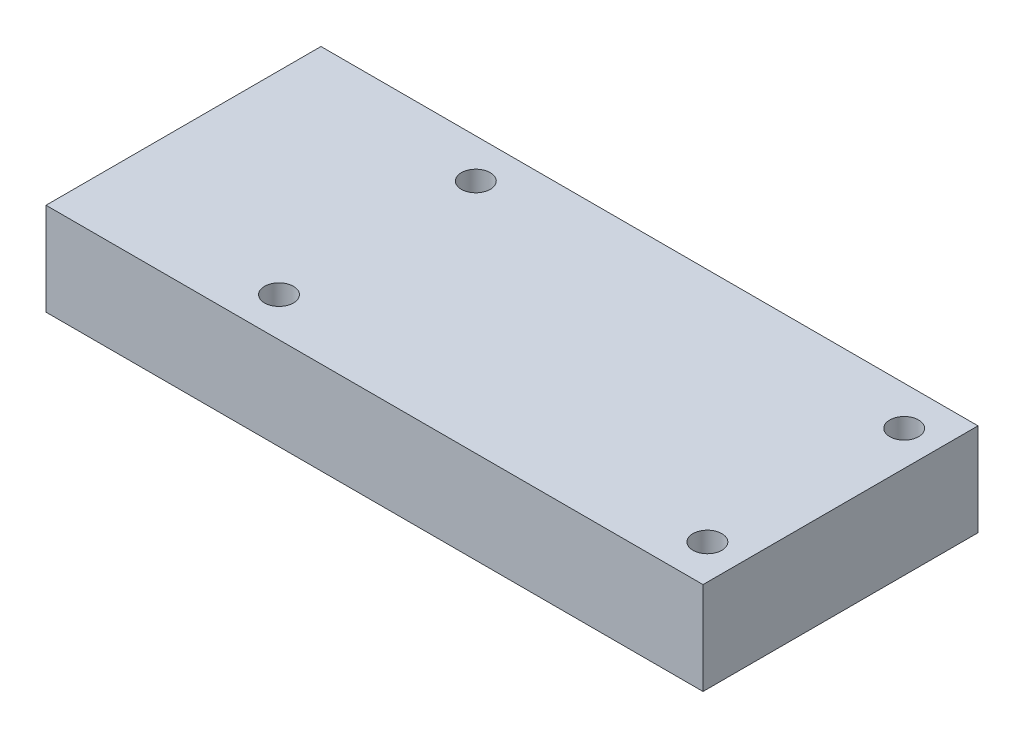
ISO-10303-21;
HEADER;
FILE_DESCRIPTION(('STEP AP214'),'2;1');
FILE_NAME('part.step','',(''),(''),'','','');
FILE_SCHEMA(('AUTOMOTIVE_DESIGN { 1 0 10303 214 1 1 1 1 }'));
ENDSEC;
DATA;
#1=APPLICATION_CONTEXT('core data for automotive mechanical design processes');
#2=APPLICATION_PROTOCOL_DEFINITION('international standard','automotive_design',2000,#1);
#3=PRODUCT_CONTEXT('',#1,'mechanical');
#4=PRODUCT('Part','Part','',(#3));
#5=PRODUCT_RELATED_PRODUCT_CATEGORY('part','',(#4));
#6=PRODUCT_DEFINITION_FORMATION('','',#4);
#7=PRODUCT_DEFINITION_CONTEXT('part definition',#1,'design');
#8=PRODUCT_DEFINITION('design','',#6,#7);
#9=PRODUCT_DEFINITION_SHAPE('','',#8);
#10=(LENGTH_UNIT() NAMED_UNIT(*) SI_UNIT(.MILLI.,.METRE.));
#11=(NAMED_UNIT(*) PLANE_ANGLE_UNIT() SI_UNIT($,.RADIAN.));
#12=(NAMED_UNIT(*) SI_UNIT($,.STERADIAN.) SOLID_ANGLE_UNIT());
#13=UNCERTAINTY_MEASURE_WITH_UNIT(LENGTH_MEASURE(1.E-05),#10,'distance_accuracy_value','');
#14=(GEOMETRIC_REPRESENTATION_CONTEXT(3) GLOBAL_UNCERTAINTY_ASSIGNED_CONTEXT((#13)) GLOBAL_UNIT_ASSIGNED_CONTEXT((#10,
#11,#12)) REPRESENTATION_CONTEXT('',''));
#15=CARTESIAN_POINT('',(0.,0.,0.));
#16=DIRECTION('',(0.,0.,1.));
#17=DIRECTION('',(1.,0.,0.));
#18=AXIS2_PLACEMENT_3D('',#15,#16,#17);
#19=CARTESIAN_POINT('',(0.,11.1125,0.));
#20=DIRECTION('',(0.,1.,0.));
#21=DIRECTION('',(-1.,0.,0.));
#22=AXIS2_PLACEMENT_3D('',#19,#20,#21);
#23=PLANE('',#22);
#24=CARTESIAN_POINT('',(-16.66875,11.1125,-9.52500000000001));
#25=DIRECTION('',(0.,1.,0.));
#26=DIRECTION('',(0.,0.,1.));
#27=AXIS2_PLACEMENT_3D('',#24,#25,#26);
#28=CIRCLE('',#27,1.5875);
#29=CARTESIAN_POINT('',(-16.66875,11.1125,-7.9375));
#30=VERTEX_POINT('',#29);
#31=EDGE_CURVE('E264',#30,#30,#28,.F.);
#32=ORIENTED_EDGE('',*,*,#31,.F.);
#33=EDGE_LOOP('',(#32));
#34=FACE_BOUND('',#33,.T.);
#35=CARTESIAN_POINT('',(-16.66875,11.1125,9.52499999999999));
#36=DIRECTION('',(0.,1.,0.));
#37=DIRECTION('',(0.,0.,1.));
#38=AXIS2_PLACEMENT_3D('',#35,#36,#37);
#39=CIRCLE('',#38,1.5875);
#40=CARTESIAN_POINT('',(-16.66875,11.1125,11.1125));
#41=VERTEX_POINT('',#40);
#42=EDGE_CURVE('E245',#41,#41,#39,.F.);
#43=ORIENTED_EDGE('',*,*,#42,.F.);
#44=EDGE_LOOP('',(#43));
#45=FACE_BOUND('',#44,.T.);
#46=CARTESIAN_POINT('',(16.66875,11.1125,-9.52500000000001));
#47=DIRECTION('',(0.,1.,0.));
#48=DIRECTION('',(0.,0.,1.));
#49=AXIS2_PLACEMENT_3D('',#46,#47,#48);
#50=CIRCLE('',#49,1.5875);
#51=CARTESIAN_POINT('',(16.66875,11.1125,-7.93750000000001));
#52=VERTEX_POINT('',#51);
#53=EDGE_CURVE('E261',#52,#52,#50,.F.);
#54=ORIENTED_EDGE('',*,*,#53,.F.);
#55=EDGE_LOOP('',(#54));
#56=FACE_BOUND('',#55,.T.);
#57=CARTESIAN_POINT('',(16.66875,11.1125,9.52499999999999));
#58=DIRECTION('',(0.,1.,0.));
#59=DIRECTION('',(0.,0.,1.));
#60=AXIS2_PLACEMENT_3D('',#57,#58,#59);
#61=CIRCLE('',#60,1.5875);
#62=CARTESIAN_POINT('',(16.66875,11.1125,11.1125));
#63=VERTEX_POINT('',#62);
#64=EDGE_CURVE('E258',#63,#63,#61,.F.);
#65=ORIENTED_EDGE('',*,*,#64,.F.);
#66=EDGE_LOOP('',(#65));
#67=FACE_BOUND('',#66,.T.);
#68=DIRECTION('',(0.,0.,1.));
#69=VECTOR('',#68,1.);
#70=CARTESIAN_POINT('',(-28.575,11.1125,-42.457115598187));
#71=LINE('',#70,#69);
#72=CARTESIAN_POINT('',(-28.575,11.1125,-15.08125));
#73=VERTEX_POINT('',#72);
#74=CARTESIAN_POINT('',(-28.575,11.1125,-3.96875));
#75=VERTEX_POINT('',#74);
#76=EDGE_CURVE('E125',#73,#75,#71,.T.);
#77=ORIENTED_EDGE('',*,*,#76,.T.);
#78=DIRECTION('',(-1.,0.,0.));
#79=VECTOR('',#78,1.);
#80=CARTESIAN_POINT('',(-22.225,11.1125,-3.96875));
#81=LINE('',#80,#79);
#82=CARTESIAN_POINT('',(-22.225,11.1125,-3.96875));
#83=VERTEX_POINT('',#82);
#84=EDGE_CURVE('E129',#83,#75,#81,.T.);
#85=ORIENTED_EDGE('',*,*,#84,.F.);
#86=DIRECTION('',(0.,0.,1.));
#87=VECTOR('',#86,1.);
#88=CARTESIAN_POINT('',(-22.225,11.1125,-42.457115598187));
#89=LINE('',#88,#87);
#90=CARTESIAN_POINT('',(-22.225,11.1125,-15.08125));
#91=VERTEX_POINT('',#90);
#92=EDGE_CURVE('E231',#91,#83,#89,.T.);
#93=ORIENTED_EDGE('',*,*,#92,.F.);
#94=DIRECTION('',(-1.,0.,0.));
#95=VECTOR('',#94,1.);
#96=CARTESIAN_POINT('',(20.6375,11.1125,-15.08125));
#97=LINE('',#96,#95);
#98=CARTESIAN_POINT('',(26.9875,11.1125,-15.08125));
#99=VERTEX_POINT('',#98);
#100=EDGE_CURVE('E50',#99,#91,#97,.T.);
#101=ORIENTED_EDGE('',*,*,#100,.F.);
#102=DIRECTION('',(0.,0.,1.));
#103=VECTOR('',#102,1.);
#104=CARTESIAN_POINT('',(26.9875,11.1125,0.));
#105=LINE('',#104,#103);
#106=CARTESIAN_POINT('',(26.9875,11.1125,15.08125));
#107=VERTEX_POINT('',#106);
#108=EDGE_CURVE('E175',#99,#107,#105,.T.);
#109=ORIENTED_EDGE('',*,*,#108,.T.);
#110=DIRECTION('',(1.,0.,0.));
#111=VECTOR('',#110,1.);
#112=CARTESIAN_POINT('',(12.3825,11.1125,15.08125));
#113=LINE('',#112,#111);
#114=CARTESIAN_POINT('',(-45.085,11.1125,15.08125));
#115=VERTEX_POINT('',#114);
#116=EDGE_CURVE('E267',#115,#107,#113,.T.);
#117=ORIENTED_EDGE('',*,*,#116,.F.);
#118=DIRECTION('',(0.,0.,1.));
#119=VECTOR('',#118,1.);
#120=CARTESIAN_POINT('',(-45.085,11.1125,-42.457115598187));
#121=LINE('',#120,#119);
#122=CARTESIAN_POINT('',(-45.085,11.1125,-3.96875));
#123=VERTEX_POINT('',#122);
#124=EDGE_CURVE('E11',#123,#115,#121,.T.);
#125=ORIENTED_EDGE('',*,*,#124,.F.);
#126=DIRECTION('',(-1.,0.,0.));
#127=VECTOR('',#126,1.);
#128=CARTESIAN_POINT('',(-38.735,11.1125,-3.96875));
#129=LINE('',#128,#127);
#130=CARTESIAN_POINT('',(-38.735,11.1125,-3.96875));
#131=VERTEX_POINT('',#130);
#132=EDGE_CURVE('E158',#131,#123,#129,.T.);
#133=ORIENTED_EDGE('',*,*,#132,.F.);
#134=DIRECTION('',(0.,0.,1.));
#135=VECTOR('',#134,1.);
#136=CARTESIAN_POINT('',(-38.735,11.1125,-42.457115598187));
#137=LINE('',#136,#135);
#138=CARTESIAN_POINT('',(-38.735,11.1125,-15.08125));
#139=VERTEX_POINT('',#138);
#140=EDGE_CURVE('E57',#139,#131,#137,.T.);
#141=ORIENTED_EDGE('',*,*,#140,.F.);
#142=DIRECTION('',(1.,0.,0.));
#143=VECTOR('',#142,1.);
#144=CARTESIAN_POINT('',(0.,11.1125,-15.08125));
#145=LINE('',#144,#143);
#146=EDGE_CURVE('E130',#139,#73,#145,.T.);
#147=ORIENTED_EDGE('',*,*,#146,.T.);
#148=EDGE_LOOP('',(#77,#85,#93,#101,#109,#117,#125,#133,#141,#147));
#149=FACE_BOUND('',#148,.T.);
#150=ADVANCED_FACE('F42',(#34,#45,#56,#67,#149),#23,.F.);
#151=CARTESIAN_POINT('',(0.,0.,15.08125));
#152=DIRECTION('',(0.,0.,1.));
#153=DIRECTION('',(1.,0.,0.));
#154=AXIS2_PLACEMENT_3D('',#151,#152,#153);
#155=PLANE('',#154);
#156=DIRECTION('',(0.,1.,0.));
#157=VECTOR('',#156,1.);
#158=CARTESIAN_POINT('',(-45.085,0.,15.08125));
#159=LINE('',#158,#157);
#160=CARTESIAN_POINT('',(-45.085,21.2725,15.08125));
#161=VERTEX_POINT('',#160);
#162=EDGE_CURVE('E224',#115,#161,#159,.T.);
#163=ORIENTED_EDGE('',*,*,#162,.F.);
#164=ORIENTED_EDGE('',*,*,#116,.T.);
#165=DIRECTION('',(0.,1.,0.));
#166=VECTOR('',#165,1.);
#167=CARTESIAN_POINT('',(26.9875,5.14349999999999,15.08125));
#168=LINE('',#167,#166);
#169=CARTESIAN_POINT('',(26.9875,21.2725,15.08125));
#170=VERTEX_POINT('',#169);
#171=EDGE_CURVE('E172',#107,#170,#168,.T.);
#172=ORIENTED_EDGE('',*,*,#171,.T.);
#173=DIRECTION('',(-1.,0.,0.));
#174=VECTOR('',#173,1.);
#175=CARTESIAN_POINT('',(20.6375,21.2725,15.08125));
#176=LINE('',#175,#174);
#177=EDGE_CURVE('E221',#170,#161,#176,.T.);
#178=ORIENTED_EDGE('',*,*,#177,.T.);
#179=EDGE_LOOP('',(#163,#164,#172,#178));
#180=FACE_BOUND('',#179,.T.);
#181=ADVANCED_FACE('F277',(#180),#155,.T.);
#182=CARTESIAN_POINT('',(0.,0.,-15.08125));
#183=DIRECTION('',(0.,0.,1.));
#184=DIRECTION('',(1.,0.,0.));
#185=AXIS2_PLACEMENT_3D('',#182,#183,#184);
#186=PLANE('',#185);
#187=DIRECTION('',(1.,0.,0.));
#188=VECTOR('',#187,1.);
#189=CARTESIAN_POINT('',(20.6375,21.2725,-15.08125));
#190=LINE('',#189,#188);
#191=CARTESIAN_POINT('',(-45.085,21.2725,-15.08125));
#192=VERTEX_POINT('',#191);
#193=CARTESIAN_POINT('',(26.9875,21.2725,-15.08125));
#194=VERTEX_POINT('',#193);
#195=EDGE_CURVE('E210',#192,#194,#190,.T.);
#196=ORIENTED_EDGE('',*,*,#195,.T.);
#197=DIRECTION('',(0.,1.,0.));
#198=VECTOR('',#197,1.);
#199=CARTESIAN_POINT('',(26.9875,5.14349999999999,-15.08125));
#200=LINE('',#199,#198);
#201=EDGE_CURVE('E171',#99,#194,#200,.T.);
#202=ORIENTED_EDGE('',*,*,#201,.F.);
#203=ORIENTED_EDGE('',*,*,#100,.T.);
#204=DIRECTION('',(0.,1.,0.));
#205=VECTOR('',#204,1.);
#206=CARTESIAN_POINT('',(-22.225,0.,-15.08125));
#207=LINE('',#206,#205);
#208=CARTESIAN_POINT('',(-22.225,8.3185,-15.08125));
#209=VERTEX_POINT('',#208);
#210=EDGE_CURVE('E237',#209,#91,#207,.T.);
#211=ORIENTED_EDGE('',*,*,#210,.F.);
#212=CARTESIAN_POINT('',(-25.4,8.3185,-15.08125));
#213=DIRECTION('',(0.,0.,1.));
#214=DIRECTION('',(1.,0.,0.));
#215=AXIS2_PLACEMENT_3D('',#212,#213,#214);
#216=CIRCLE('',#215,3.175);
#217=CARTESIAN_POINT('',(-28.575,8.3185,-15.08125));
#218=VERTEX_POINT('',#217);
#219=EDGE_CURVE('E235',#209,#218,#216,.F.);
#220=ORIENTED_EDGE('',*,*,#219,.T.);
#221=DIRECTION('',(0.,1.,0.));
#222=VECTOR('',#221,1.);
#223=CARTESIAN_POINT('',(-28.575,0.,-15.08125));
#224=LINE('',#223,#222);
#225=EDGE_CURVE('E233',#218,#73,#224,.T.);
#226=ORIENTED_EDGE('',*,*,#225,.T.);
#227=ORIENTED_EDGE('',*,*,#146,.F.);
#228=DIRECTION('',(0.,1.,0.));
#229=VECTOR('',#228,1.);
#230=CARTESIAN_POINT('',(-38.735,0.,-15.08125));
#231=LINE('',#230,#229);
#232=CARTESIAN_POINT('',(-38.735,8.31850000000001,-15.08125));
#233=VERTEX_POINT('',#232);
#234=EDGE_CURVE('E229',#233,#139,#231,.T.);
#235=ORIENTED_EDGE('',*,*,#234,.F.);
#236=CARTESIAN_POINT('',(-41.91,8.3185,-15.08125));
#237=DIRECTION('',(0.,0.,1.));
#238=DIRECTION('',(1.,0.,0.));
#239=AXIS2_PLACEMENT_3D('',#236,#237,#238);
#240=CIRCLE('',#239,3.175);
#241=CARTESIAN_POINT('',(-45.085,8.3185,-15.08125));
#242=VERTEX_POINT('',#241);
#243=EDGE_CURVE('E225',#233,#242,#240,.F.);
#244=ORIENTED_EDGE('',*,*,#243,.T.);
#245=DIRECTION('',(0.,-1.,0.));
#246=VECTOR('',#245,1.);
#247=CARTESIAN_POINT('',(-45.085,0.,-15.08125));
#248=LINE('',#247,#246);
#249=EDGE_CURVE('E228',#192,#242,#248,.T.);
#250=ORIENTED_EDGE('',*,*,#249,.F.);
#251=EDGE_LOOP('',(#196,#202,#203,#211,#220,#226,#227,#235,#244,#250));
#252=FACE_BOUND('',#251,.T.);
#253=CARTESIAN_POINT('',(-25.4,8.31850000000001,-15.08125));
#254=DIRECTION('',(0.,0.,1.));
#255=DIRECTION('',(1.,0.,0.));
#256=AXIS2_PLACEMENT_3D('',#253,#254,#255);
#257=CIRCLE('',#256,1.78593749999999);
#258=CARTESIAN_POINT('',(-23.6140625,8.31850000000001,-15.08125));
#259=VERTEX_POINT('',#258);
#260=EDGE_CURVE('E227',#259,#259,#257,.F.);
#261=ORIENTED_EDGE('',*,*,#260,.F.);
#262=EDGE_LOOP('',(#261));
#263=FACE_BOUND('',#262,.T.);
#264=CARTESIAN_POINT('',(-41.91,8.3185,-15.08125));
#265=DIRECTION('',(0.,0.,1.));
#266=DIRECTION('',(1.,0.,0.));
#267=AXIS2_PLACEMENT_3D('',#264,#265,#266);
#268=CIRCLE('',#267,1.78593749999999);
#269=CARTESIAN_POINT('',(-40.1240625,8.3185,-15.08125));
#270=VERTEX_POINT('',#269);
#271=EDGE_CURVE('E242',#270,#270,#268,.F.);
#272=ORIENTED_EDGE('',*,*,#271,.F.);
#273=EDGE_LOOP('',(#272));
#274=FACE_BOUND('',#273,.T.);
#275=ADVANCED_FACE('F44',(#252,#263,#274),#186,.F.);
#276=CARTESIAN_POINT('',(-16.66875,1.85987193946543,-9.52500000000001));
#277=DIRECTION('',(0.,1.,0.));
#278=DIRECTION('',(0.,0.,1.));
#279=AXIS2_PLACEMENT_3D('',#276,#277,#278);
#280=CYLINDRICAL_SURFACE('',#279,1.5875);
#281=ORIENTED_EDGE('',*,*,#31,.T.);
#282=EDGE_LOOP('',(#281));
#283=FACE_BOUND('',#282,.T.);
#284=CARTESIAN_POINT('',(-16.66875,17.4625,-9.52500000000001));
#285=DIRECTION('',(0.,1.,0.));
#286=DIRECTION('',(-1.,0.,0.));
#287=AXIS2_PLACEMENT_3D('',#284,#285,#286);
#288=CIRCLE('',#287,1.5875);
#289=CARTESIAN_POINT('',(-18.25625,17.4625,-9.52500000000001));
#290=VERTEX_POINT('',#289);
#291=EDGE_CURVE('E203',#290,#290,#288,.F.);
#292=ORIENTED_EDGE('',*,*,#291,.F.);
#293=EDGE_LOOP('',(#292));
#294=FACE_BOUND('',#293,.T.);
#295=ADVANCED_FACE('F363',(#283,#294),#280,.F.);
#296=CARTESIAN_POINT('',(16.66875,1.85987193946543,-9.52500000000001));
#297=DIRECTION('',(0.,1.,0.));
#298=DIRECTION('',(0.,0.,1.));
#299=AXIS2_PLACEMENT_3D('',#296,#297,#298);
#300=CYLINDRICAL_SURFACE('',#299,1.5875);
#301=ORIENTED_EDGE('',*,*,#53,.T.);
#302=EDGE_LOOP('',(#301));
#303=FACE_BOUND('',#302,.T.);
#304=CARTESIAN_POINT('',(16.66875,17.4625,-9.52500000000001));
#305=DIRECTION('',(0.,1.,0.));
#306=DIRECTION('',(-1.,0.,0.));
#307=AXIS2_PLACEMENT_3D('',#304,#305,#306);
#308=CIRCLE('',#307,1.5875);
#309=CARTESIAN_POINT('',(15.08125,17.4625,-9.52500000000001));
#310=VERTEX_POINT('',#309);
#311=EDGE_CURVE('E200',#310,#310,#308,.F.);
#312=ORIENTED_EDGE('',*,*,#311,.F.);
#313=EDGE_LOOP('',(#312));
#314=FACE_BOUND('',#313,.T.);
#315=ADVANCED_FACE('F287',(#303,#314),#300,.F.);
#316=CARTESIAN_POINT('',(16.66875,1.85987193946543,9.52499999999999));
#317=DIRECTION('',(0.,1.,0.));
#318=DIRECTION('',(0.,0.,1.));
#319=AXIS2_PLACEMENT_3D('',#316,#317,#318);
#320=CYLINDRICAL_SURFACE('',#319,1.5875);
#321=ORIENTED_EDGE('',*,*,#64,.T.);
#322=EDGE_LOOP('',(#321));
#323=FACE_BOUND('',#322,.T.);
#324=CARTESIAN_POINT('',(16.66875,17.4625,9.52499999999999));
#325=DIRECTION('',(0.,1.,0.));
#326=DIRECTION('',(-1.,0.,0.));
#327=AXIS2_PLACEMENT_3D('',#324,#325,#326);
#328=CIRCLE('',#327,1.5875);
#329=CARTESIAN_POINT('',(15.08125,17.4625,9.52499999999999));
#330=VERTEX_POINT('',#329);
#331=EDGE_CURVE('E197',#330,#330,#328,.F.);
#332=ORIENTED_EDGE('',*,*,#331,.F.);
#333=EDGE_LOOP('',(#332));
#334=FACE_BOUND('',#333,.T.);
#335=ADVANCED_FACE('F284',(#323,#334),#320,.F.);
#336=CARTESIAN_POINT('',(-16.66875,1.85987193946543,9.52499999999999));
#337=DIRECTION('',(0.,1.,0.));
#338=DIRECTION('',(0.,0.,1.));
#339=AXIS2_PLACEMENT_3D('',#336,#337,#338);
#340=CYLINDRICAL_SURFACE('',#339,1.5875);
#341=ORIENTED_EDGE('',*,*,#42,.T.);
#342=EDGE_LOOP('',(#341));
#343=FACE_BOUND('',#342,.T.);
#344=CARTESIAN_POINT('',(-16.66875,17.4625,9.52499999999999));
#345=DIRECTION('',(0.,1.,0.));
#346=DIRECTION('',(-1.,0.,0.));
#347=AXIS2_PLACEMENT_3D('',#344,#345,#346);
#348=CIRCLE('',#347,1.5875);
#349=CARTESIAN_POINT('',(-18.25625,17.4625,9.52499999999999));
#350=VERTEX_POINT('',#349);
#351=EDGE_CURVE('E194',#350,#350,#348,.F.);
#352=ORIENTED_EDGE('',*,*,#351,.F.);
#353=EDGE_LOOP('',(#352));
#354=FACE_BOUND('',#353,.T.);
#355=ADVANCED_FACE('F272',(#343,#354),#340,.F.);
#356=CARTESIAN_POINT('',(-41.91,8.3185,-42.457115598187));
#357=DIRECTION('',(0.,0.,1.));
#358=DIRECTION('',(1.,0.,0.));
#359=AXIS2_PLACEMENT_3D('',#356,#357,#358);
#360=CYLINDRICAL_SURFACE('',#359,1.78593749999999);
#361=CARTESIAN_POINT('',(-41.91,8.3185,-7.14375));
#362=DIRECTION('',(0.,0.,1.));
#363=DIRECTION('',(1.,0.,0.));
#364=AXIS2_PLACEMENT_3D('',#361,#362,#363);
#365=CIRCLE('',#364,1.78593749999999);
#366=CARTESIAN_POINT('',(-40.1240625,8.3185,-7.14375));
#367=VERTEX_POINT('',#366);
#368=EDGE_CURVE('E166',#367,#367,#365,.F.);
#369=CARTESIAN_POINT('',(-40.1240625,8.3185,-7.14375));
#370=CARTESIAN_POINT('',(-40.1240625,8.3185,-7.22643229166666));
#371=CARTESIAN_POINT('',(-40.1240625,8.3185,-7.30911458333333));
#372=CARTESIAN_POINT('',(-40.1240625,8.3185,-7.47447916666666));
#373=CARTESIAN_POINT('',(-40.1240625,8.3185,-7.55716145833333));
#374=CARTESIAN_POINT('',(-40.1240625,8.3185,-7.72252604166667));
#375=CARTESIAN_POINT('',(-40.1240625,8.3185,-7.80520833333333));
#376=CARTESIAN_POINT('',(-40.1240625,8.3185,-7.97057291666666));
#377=CARTESIAN_POINT('',(-40.1240625,8.3185,-8.05325520833333));
#378=CARTESIAN_POINT('',(-40.1240625,8.3185,-8.21861979166667));
#379=CARTESIAN_POINT('',(-40.1240625,8.3185,-8.30130208333333));
#380=CARTESIAN_POINT('',(-40.1240625,8.3185,-8.46666666666667));
#381=CARTESIAN_POINT('',(-40.1240625,8.3185,-8.54934895833333));
#382=CARTESIAN_POINT('',(-40.1240625,8.3185,-8.71471354166666));
#383=CARTESIAN_POINT('',(-40.1240625,8.3185,-8.79739583333333));
#384=CARTESIAN_POINT('',(-40.1240625,8.3185,-8.96276041666667));
#385=CARTESIAN_POINT('',(-40.1240625,8.3185,-9.04544270833333));
#386=CARTESIAN_POINT('',(-40.1240625,8.3185,-9.21080729166667));
#387=CARTESIAN_POINT('',(-40.1240625,8.3185,-9.29348958333333));
#388=CARTESIAN_POINT('',(-40.1240625,8.3185,-9.45885416666666));
#389=CARTESIAN_POINT('',(-40.1240625,8.3185,-9.54153645833333));
#390=CARTESIAN_POINT('',(-40.1240625,8.3185,-9.70690104166667));
#391=CARTESIAN_POINT('',(-40.1240625,8.3185,-9.78958333333333));
#392=CARTESIAN_POINT('',(-40.1240625,8.3185,-9.95494791666667));
#393=CARTESIAN_POINT('',(-40.1240625,8.3185,-10.0376302083333));
#394=CARTESIAN_POINT('',(-40.1240625,8.3185,-10.2029947916667));
#395=CARTESIAN_POINT('',(-40.1240625,8.3185,-10.2856770833333));
#396=CARTESIAN_POINT('',(-40.1240625,8.3185,-10.4510416666667));
#397=CARTESIAN_POINT('',(-40.1240625,8.3185,-10.5337239583333));
#398=CARTESIAN_POINT('',(-40.1240625,8.3185,-10.6990885416667));
#399=CARTESIAN_POINT('',(-40.1240625,8.3185,-10.7817708333333));
#400=CARTESIAN_POINT('',(-40.1240625,8.3185,-10.9471354166667));
#401=CARTESIAN_POINT('',(-40.1240625,8.3185,-11.0298177083333));
#402=CARTESIAN_POINT('',(-40.1240625,8.3185,-11.1951822916667));
#403=CARTESIAN_POINT('',(-40.1240625,8.3185,-11.2778645833333));
#404=CARTESIAN_POINT('',(-40.1240625,8.3185,-11.4432291666667));
#405=CARTESIAN_POINT('',(-40.1240625,8.3185,-11.5259114583333));
#406=CARTESIAN_POINT('',(-40.1240625,8.3185,-11.6912760416667));
#407=CARTESIAN_POINT('',(-40.1240625,8.3185,-11.7739583333333));
#408=CARTESIAN_POINT('',(-40.1240625,8.3185,-11.9393229166667));
#409=CARTESIAN_POINT('',(-40.1240625,8.3185,-12.0220052083333));
#410=CARTESIAN_POINT('',(-40.1240625,8.3185,-12.1873697916667));
#411=CARTESIAN_POINT('',(-40.1240625,8.3185,-12.2700520833333));
#412=CARTESIAN_POINT('',(-40.1240625,8.3185,-12.4354166666667));
#413=CARTESIAN_POINT('',(-40.1240625,8.3185,-12.5180989583333));
#414=CARTESIAN_POINT('',(-40.1240625,8.3185,-12.6834635416667));
#415=CARTESIAN_POINT('',(-40.1240625,8.3185,-12.7661458333333));
#416=CARTESIAN_POINT('',(-40.1240625,8.3185,-12.9315104166667));
#417=CARTESIAN_POINT('',(-40.1240625,8.3185,-13.0141927083333));
#418=CARTESIAN_POINT('',(-40.1240625,8.3185,-13.1795572916667));
#419=CARTESIAN_POINT('',(-40.1240625,8.3185,-13.2622395833333));
#420=CARTESIAN_POINT('',(-40.1240625,8.3185,-13.4276041666667));
#421=CARTESIAN_POINT('',(-40.1240625,8.3185,-13.5102864583333));
#422=CARTESIAN_POINT('',(-40.1240625,8.3185,-13.6756510416667));
#423=CARTESIAN_POINT('',(-40.1240625,8.3185,-13.7583333333333));
#424=CARTESIAN_POINT('',(-40.1240625,8.3185,-13.9236979166667));
#425=CARTESIAN_POINT('',(-40.1240625,8.3185,-14.0063802083333));
#426=CARTESIAN_POINT('',(-40.1240625,8.3185,-14.1717447916667));
#427=CARTESIAN_POINT('',(-40.1240625,8.3185,-14.2544270833333));
#428=CARTESIAN_POINT('',(-40.1240625,8.3185,-14.4197916666667));
#429=CARTESIAN_POINT('',(-40.1240625,8.3185,-14.5024739583333));
#430=CARTESIAN_POINT('',(-40.1240625,8.3185,-14.6678385416667));
#431=CARTESIAN_POINT('',(-40.1240625,8.3185,-14.7505208333333));
#432=CARTESIAN_POINT('',(-40.1240625,8.3185,-14.9158854166667));
#433=CARTESIAN_POINT('',(-40.1240625,8.3185,-14.9985677083333));
#434=CARTESIAN_POINT('',(-40.1240625,8.3185,-15.08125));
#435=B_SPLINE_CURVE_WITH_KNOTS('',3,(#369,#370,#371,#372,#373,#374,#375,#376,#377,#378,#379,
#380,#381,#382,#383,#384,#385,#386,#387,#388,#389,#390,#391,#392,#393,#394,#395,#396,#397,#398,
#399,#400,#401,#402,#403,#404,#405,#406,#407,#408,#409,#410,#411,#412,#413,#414,#415,#416,#417,
#418,#419,#420,#421,#422,#423,#424,#425,#426,#427,#428,#429,#430,#431,#432,#433,#434),
.UNSPECIFIED.,.F.,.F.,(4,2,2,2,2,2,2,2,2,2,2,2,2,2,2,2,2,2,2,2,2,2,2,2,2,2,2,2,2,2,2,2,4),(0.,
0.248046874999998,0.496093750000003,0.744140625,0.992187499999998,1.240234375,1.48828125,
1.736328125,1.984375,2.232421875,2.48046875,2.728515625,2.9765625,3.22460937500001,3.47265625,
3.720703125,3.96875000000001,4.216796875,4.46484375,4.712890625,4.9609375,5.208984375,
5.45703125,5.705078125,5.953125,6.201171875,6.44921875,6.697265625,6.9453125,7.193359375,
7.44140625,7.689453125,7.9375),.UNSPECIFIED.);
#436=EDGE_CURVE('BSEAM335',#367,#270,#435,.T.);
#437=ORIENTED_EDGE('',*,*,#368,.F.);
#438=ORIENTED_EDGE('',*,*,#271,.T.);
#439=ORIENTED_EDGE('',*,*,#436,.T.);
#440=ORIENTED_EDGE('',*,*,#436,.F.);
#441=EDGE_LOOP('',(#437,#439,#438,#440));
#442=FACE_BOUND('',#441,.T.);
#443=ADVANCED_FACE('F335',(#442),#360,.F.);
#444=CARTESIAN_POINT('',(-41.91,8.3185,-42.457115598187));
#445=DIRECTION('',(0.,0.,1.));
#446=DIRECTION('',(1.,0.,0.));
#447=AXIS2_PLACEMENT_3D('',#444,#445,#446);
#448=CYLINDRICAL_SURFACE('',#447,3.175);
#449=DIRECTION('',(0.,0.,1.));
#450=VECTOR('',#449,1.);
#451=CARTESIAN_POINT('',(-38.735,8.31850000000001,-42.457115598187));
#452=LINE('',#451,#450);
#453=CARTESIAN_POINT('',(-38.735,8.3185,-3.96875));
#454=VERTEX_POINT('',#453);
#455=EDGE_CURVE('E253',#233,#454,#452,.T.);
#456=ORIENTED_EDGE('',*,*,#455,.T.);
#457=CARTESIAN_POINT('',(-41.91,8.3185,-3.96875));
#458=DIRECTION('',(0.,0.,1.));
#459=DIRECTION('',(1.,0.,0.));
#460=AXIS2_PLACEMENT_3D('',#457,#458,#459);
#461=CIRCLE('',#460,3.175);
#462=CARTESIAN_POINT('',(-45.085,8.3185,-3.96875));
#463=VERTEX_POINT('',#462);
#464=EDGE_CURVE('E163',#463,#454,#461,.T.);
#465=ORIENTED_EDGE('',*,*,#464,.F.);
#466=DIRECTION('',(0.,0.,1.));
#467=VECTOR('',#466,1.);
#468=CARTESIAN_POINT('',(-45.085,8.3185,-42.457115598187));
#469=LINE('',#468,#467);
#470=EDGE_CURVE('E247',#242,#463,#469,.T.);
#471=ORIENTED_EDGE('',*,*,#470,.F.);
#472=ORIENTED_EDGE('',*,*,#243,.F.);
#473=EDGE_LOOP('',(#456,#465,#471,#472));
#474=FACE_BOUND('',#473,.T.);
#475=ADVANCED_FACE('F338',(#474),#448,.T.);
#476=CARTESIAN_POINT('',(-38.735,0.,-42.457115598187));
#477=DIRECTION('',(-1.,0.,0.));
#478=DIRECTION('',(0.,0.,1.));
#479=AXIS2_PLACEMENT_3D('',#476,#477,#478);
#480=PLANE('',#479);
#481=ORIENTED_EDGE('',*,*,#140,.T.);
#482=DIRECTION('',(0.,1.,0.));
#483=VECTOR('',#482,1.);
#484=CARTESIAN_POINT('',(-38.735,8.31850000000001,-3.96875));
#485=LINE('',#484,#483);
#486=EDGE_CURVE('E155',#454,#131,#485,.T.);
#487=ORIENTED_EDGE('',*,*,#486,.F.);
#488=ORIENTED_EDGE('',*,*,#455,.F.);
#489=ORIENTED_EDGE('',*,*,#234,.T.);
#490=EDGE_LOOP('',(#481,#487,#488,#489));
#491=FACE_BOUND('',#490,.T.);
#492=ADVANCED_FACE('F350',(#491),#480,.F.);
#493=CARTESIAN_POINT('',(-28.575,0.,-42.457115598187));
#494=DIRECTION('',(-1.,0.,0.));
#495=DIRECTION('',(0.,-1.,0.));
#496=AXIS2_PLACEMENT_3D('',#493,#494,#495);
#497=PLANE('',#496);
#498=DIRECTION('',(0.,0.,1.));
#499=VECTOR('',#498,1.);
#500=CARTESIAN_POINT('',(-28.575,8.3185,-42.457115598187));
#501=LINE('',#500,#499);
#502=CARTESIAN_POINT('',(-28.575,8.3185,-3.96875));
#503=VERTEX_POINT('',#502);
#504=EDGE_CURVE('E133',#218,#503,#501,.T.);
#505=ORIENTED_EDGE('',*,*,#504,.T.);
#506=DIRECTION('',(0.,-1.,0.));
#507=VECTOR('',#506,1.);
#508=CARTESIAN_POINT('',(-28.575,11.1125,-3.96875));
#509=LINE('',#508,#507);
#510=EDGE_CURVE('E136',#75,#503,#509,.T.);
#511=ORIENTED_EDGE('',*,*,#510,.F.);
#512=ORIENTED_EDGE('',*,*,#76,.F.);
#513=ORIENTED_EDGE('',*,*,#225,.F.);
#514=EDGE_LOOP('',(#505,#511,#512,#513));
#515=FACE_BOUND('',#514,.T.);
#516=ADVANCED_FACE('F137',(#515),#497,.T.);
#517=CARTESIAN_POINT('',(-25.4,8.3185,-42.457115598187));
#518=DIRECTION('',(0.,0.,1.));
#519=DIRECTION('',(1.,0.,0.));
#520=AXIS2_PLACEMENT_3D('',#517,#518,#519);
#521=CYLINDRICAL_SURFACE('',#520,3.175);
#522=DIRECTION('',(0.,0.,1.));
#523=VECTOR('',#522,1.);
#524=CARTESIAN_POINT('',(-22.225,8.3185,-42.457115598187));
#525=LINE('',#524,#523);
#526=CARTESIAN_POINT('',(-22.225,8.3185,-3.96875));
#527=VERTEX_POINT('',#526);
#528=EDGE_CURVE('E249',#209,#527,#525,.T.);
#529=ORIENTED_EDGE('',*,*,#528,.T.);
#530=CARTESIAN_POINT('',(-25.4,8.3185,-3.96875));
#531=DIRECTION('',(0.,0.,1.));
#532=DIRECTION('',(1.,0.,0.));
#533=AXIS2_PLACEMENT_3D('',#530,#531,#532);
#534=CIRCLE('',#533,3.175);
#535=EDGE_CURVE('E142',#503,#527,#534,.T.);
#536=ORIENTED_EDGE('',*,*,#535,.F.);
#537=ORIENTED_EDGE('',*,*,#504,.F.);
#538=ORIENTED_EDGE('',*,*,#219,.F.);
#539=EDGE_LOOP('',(#529,#536,#537,#538));
#540=FACE_BOUND('',#539,.T.);
#541=ADVANCED_FACE('F343',(#540),#521,.T.);
#542=CARTESIAN_POINT('',(-22.225,0.,-42.457115598187));
#543=DIRECTION('',(-1.,0.,0.));
#544=DIRECTION('',(0.,0.,1.));
#545=AXIS2_PLACEMENT_3D('',#542,#543,#544);
#546=PLANE('',#545);
#547=ORIENTED_EDGE('',*,*,#92,.T.);
#548=DIRECTION('',(0.,1.,0.));
#549=VECTOR('',#548,1.);
#550=CARTESIAN_POINT('',(-22.225,8.3185,-3.96875));
#551=LINE('',#550,#549);
#552=EDGE_CURVE('E147',#527,#83,#551,.T.);
#553=ORIENTED_EDGE('',*,*,#552,.F.);
#554=ORIENTED_EDGE('',*,*,#528,.F.);
#555=ORIENTED_EDGE('',*,*,#210,.T.);
#556=EDGE_LOOP('',(#547,#553,#554,#555));
#557=FACE_BOUND('',#556,.T.);
#558=ADVANCED_FACE('F340',(#557),#546,.F.);
#559=CARTESIAN_POINT('',(-45.085,0.,-42.457115598187));
#560=DIRECTION('',(1.,0.,0.));
#561=DIRECTION('',(0.,0.,-1.));
#562=AXIS2_PLACEMENT_3D('',#559,#560,#561);
#563=PLANE('',#562);
#564=DIRECTION('',(0.,-1.,0.));
#565=VECTOR('',#564,1.);
#566=CARTESIAN_POINT('',(-45.085,11.1125,-3.96875));
#567=LINE('',#566,#565);
#568=EDGE_CURVE('E160',#123,#463,#567,.T.);
#569=ORIENTED_EDGE('',*,*,#568,.F.);
#570=ORIENTED_EDGE('',*,*,#124,.T.);
#571=ORIENTED_EDGE('',*,*,#162,.T.);
#572=DIRECTION('',(0.,0.,1.));
#573=VECTOR('',#572,1.);
#574=CARTESIAN_POINT('',(-45.085,21.2725,15.08125));
#575=LINE('',#574,#573);
#576=EDGE_CURVE('E183',#192,#161,#575,.T.);
#577=ORIENTED_EDGE('',*,*,#576,.F.);
#578=ORIENTED_EDGE('',*,*,#249,.T.);
#579=ORIENTED_EDGE('',*,*,#470,.T.);
#580=EDGE_LOOP('',(#569,#570,#571,#577,#578,#579));
#581=FACE_BOUND('',#580,.T.);
#582=ADVANCED_FACE('F333',(#581),#563,.F.);
#583=CARTESIAN_POINT('',(-25.4,8.31850000000001,-42.457115598187));
#584=DIRECTION('',(0.,0.,1.));
#585=DIRECTION('',(1.,0.,0.));
#586=AXIS2_PLACEMENT_3D('',#583,#584,#585);
#587=CYLINDRICAL_SURFACE('',#586,1.78593749999999);
#588=CARTESIAN_POINT('',(-25.4,8.31850000000001,-7.14375));
#589=DIRECTION('',(0.,0.,1.));
#590=DIRECTION('',(1.,0.,0.));
#591=AXIS2_PLACEMENT_3D('',#588,#589,#590);
#592=CIRCLE('',#591,1.78593749999999);
#593=CARTESIAN_POINT('',(-23.6140625,8.31850000000001,-7.14375));
#594=VERTEX_POINT('',#593);
#595=EDGE_CURVE('E152',#594,#594,#592,.F.);
#596=CARTESIAN_POINT('',(-23.6140625,8.31850000000001,-7.14375));
#597=CARTESIAN_POINT('',(-23.6140625,8.31850000000001,-7.22643229166666));
#598=CARTESIAN_POINT('',(-23.6140625,8.31850000000001,-7.30911458333333));
#599=CARTESIAN_POINT('',(-23.6140625,8.31850000000001,-7.47447916666666));
#600=CARTESIAN_POINT('',(-23.6140625,8.31850000000001,-7.55716145833333));
#601=CARTESIAN_POINT('',(-23.6140625,8.31850000000001,-7.72252604166667));
#602=CARTESIAN_POINT('',(-23.6140625,8.31850000000001,-7.80520833333333));
#603=CARTESIAN_POINT('',(-23.6140625,8.31850000000001,-7.97057291666666));
#604=CARTESIAN_POINT('',(-23.6140625,8.31850000000001,-8.05325520833333));
#605=CARTESIAN_POINT('',(-23.6140625,8.31850000000001,-8.21861979166667));
#606=CARTESIAN_POINT('',(-23.6140625,8.31850000000001,-8.30130208333333));
#607=CARTESIAN_POINT('',(-23.6140625,8.31850000000001,-8.46666666666667));
#608=CARTESIAN_POINT('',(-23.6140625,8.31850000000001,-8.54934895833333));
#609=CARTESIAN_POINT('',(-23.6140625,8.31850000000001,-8.71471354166666));
#610=CARTESIAN_POINT('',(-23.6140625,8.31850000000001,-8.79739583333333));
#611=CARTESIAN_POINT('',(-23.6140625,8.31850000000001,-8.96276041666667));
#612=CARTESIAN_POINT('',(-23.6140625,8.31850000000001,-9.04544270833333));
#613=CARTESIAN_POINT('',(-23.6140625,8.31850000000001,-9.21080729166667));
#614=CARTESIAN_POINT('',(-23.6140625,8.31850000000001,-9.29348958333333));
#615=CARTESIAN_POINT('',(-23.6140625,8.31850000000001,-9.45885416666666));
#616=CARTESIAN_POINT('',(-23.6140625,8.31850000000001,-9.54153645833333));
#617=CARTESIAN_POINT('',(-23.6140625,8.31850000000001,-9.70690104166667));
#618=CARTESIAN_POINT('',(-23.6140625,8.31850000000001,-9.78958333333333));
#619=CARTESIAN_POINT('',(-23.6140625,8.31850000000001,-9.95494791666667));
#620=CARTESIAN_POINT('',(-23.6140625,8.31850000000001,-10.0376302083333));
#621=CARTESIAN_POINT('',(-23.6140625,8.31850000000001,-10.2029947916667));
#622=CARTESIAN_POINT('',(-23.6140625,8.31850000000001,-10.2856770833333));
#623=CARTESIAN_POINT('',(-23.6140625,8.31850000000001,-10.4510416666667));
#624=CARTESIAN_POINT('',(-23.6140625,8.31850000000001,-10.5337239583333));
#625=CARTESIAN_POINT('',(-23.6140625,8.31850000000001,-10.6990885416667));
#626=CARTESIAN_POINT('',(-23.6140625,8.31850000000001,-10.7817708333333));
#627=CARTESIAN_POINT('',(-23.6140625,8.31850000000001,-10.9471354166667));
#628=CARTESIAN_POINT('',(-23.6140625,8.31850000000001,-11.0298177083333));
#629=CARTESIAN_POINT('',(-23.6140625,8.31850000000001,-11.1951822916667));
#630=CARTESIAN_POINT('',(-23.6140625,8.31850000000001,-11.2778645833333));
#631=CARTESIAN_POINT('',(-23.6140625,8.31850000000001,-11.4432291666667));
#632=CARTESIAN_POINT('',(-23.6140625,8.31850000000001,-11.5259114583333));
#633=CARTESIAN_POINT('',(-23.6140625,8.31850000000001,-11.6912760416667));
#634=CARTESIAN_POINT('',(-23.6140625,8.31850000000001,-11.7739583333333));
#635=CARTESIAN_POINT('',(-23.6140625,8.31850000000001,-11.9393229166667));
#636=CARTESIAN_POINT('',(-23.6140625,8.31850000000001,-12.0220052083333));
#637=CARTESIAN_POINT('',(-23.6140625,8.31850000000001,-12.1873697916667));
#638=CARTESIAN_POINT('',(-23.6140625,8.31850000000001,-12.2700520833333));
#639=CARTESIAN_POINT('',(-23.6140625,8.31850000000001,-12.4354166666667));
#640=CARTESIAN_POINT('',(-23.6140625,8.31850000000001,-12.5180989583333));
#641=CARTESIAN_POINT('',(-23.6140625,8.31850000000001,-12.6834635416667));
#642=CARTESIAN_POINT('',(-23.6140625,8.31850000000001,-12.7661458333333));
#643=CARTESIAN_POINT('',(-23.6140625,8.31850000000001,-12.9315104166667));
#644=CARTESIAN_POINT('',(-23.6140625,8.31850000000001,-13.0141927083333));
#645=CARTESIAN_POINT('',(-23.6140625,8.31850000000001,-13.1795572916667));
#646=CARTESIAN_POINT('',(-23.6140625,8.31850000000001,-13.2622395833333));
#647=CARTESIAN_POINT('',(-23.6140625,8.31850000000001,-13.4276041666667));
#648=CARTESIAN_POINT('',(-23.6140625,8.31850000000001,-13.5102864583333));
#649=CARTESIAN_POINT('',(-23.6140625,8.31850000000001,-13.6756510416667));
#650=CARTESIAN_POINT('',(-23.6140625,8.31850000000001,-13.7583333333333));
#651=CARTESIAN_POINT('',(-23.6140625,8.31850000000001,-13.9236979166667));
#652=CARTESIAN_POINT('',(-23.6140625,8.31850000000001,-14.0063802083333));
#653=CARTESIAN_POINT('',(-23.6140625,8.31850000000001,-14.1717447916667));
#654=CARTESIAN_POINT('',(-23.6140625,8.31850000000001,-14.2544270833333));
#655=CARTESIAN_POINT('',(-23.6140625,8.31850000000001,-14.4197916666667));
#656=CARTESIAN_POINT('',(-23.6140625,8.31850000000001,-14.5024739583333));
#657=CARTESIAN_POINT('',(-23.6140625,8.31850000000001,-14.6678385416667));
#658=CARTESIAN_POINT('',(-23.6140625,8.31850000000001,-14.7505208333333));
#659=CARTESIAN_POINT('',(-23.6140625,8.31850000000001,-14.9158854166667));
#660=CARTESIAN_POINT('',(-23.6140625,8.31850000000001,-14.9985677083333));
#661=CARTESIAN_POINT('',(-23.6140625,8.31850000000001,-15.08125));
#662=B_SPLINE_CURVE_WITH_KNOTS('',3,(#596,#597,#598,#599,#600,#601,#602,#603,#604,#605,#606,
#607,#608,#609,#610,#611,#612,#613,#614,#615,#616,#617,#618,#619,#620,#621,#622,#623,#624,#625,
#626,#627,#628,#629,#630,#631,#632,#633,#634,#635,#636,#637,#638,#639,#640,#641,#642,#643,#644,
#645,#646,#647,#648,#649,#650,#651,#652,#653,#654,#655,#656,#657,#658,#659,#660,#661),
.UNSPECIFIED.,.F.,.F.,(4,2,2,2,2,2,2,2,2,2,2,2,2,2,2,2,2,2,2,2,2,2,2,2,2,2,2,2,2,2,2,2,4),(0.,
0.248046874999998,0.496093750000003,0.744140625,0.992187499999998,1.240234375,1.48828125,
1.736328125,1.984375,2.232421875,2.48046875,2.728515625,2.9765625,3.22460937500001,3.47265625,
3.720703125,3.96875000000001,4.216796875,4.46484375,4.712890625,4.9609375,5.208984375,
5.45703125,5.705078125,5.953125,6.201171875,6.44921875,6.697265625,6.9453125,7.193359375,
7.44140625,7.689453125,7.9375),.UNSPECIFIED.);
#663=EDGE_CURVE('BSEAM329',#594,#259,#662,.T.);
#664=ORIENTED_EDGE('',*,*,#595,.F.);
#665=ORIENTED_EDGE('',*,*,#260,.T.);
#666=ORIENTED_EDGE('',*,*,#663,.T.);
#667=ORIENTED_EDGE('',*,*,#663,.F.);
#668=EDGE_LOOP('',(#664,#666,#665,#667));
#669=FACE_BOUND('',#668,.T.);
#670=ADVANCED_FACE('F329',(#669),#587,.F.);
#671=CARTESIAN_POINT('',(0.,21.2725,0.));
#672=DIRECTION('',(0.,-1.,0.));
#673=DIRECTION('',(1.,0.,0.));
#674=AXIS2_PLACEMENT_3D('',#671,#672,#673);
#675=PLANE('',#674);
#676=CARTESIAN_POINT('',(-23.8125,21.2725,-10.795));
#677=DIRECTION('',(0.,1.,0.));
#678=DIRECTION('',(-1.,0.,0.));
#679=AXIS2_PLACEMENT_3D('',#676,#677,#678);
#680=CIRCLE('',#679,1.5875);
#681=CARTESIAN_POINT('',(-25.4,21.2725,-10.795));
#682=VERTEX_POINT('',#681);
#683=EDGE_CURVE('E179',#682,#682,#680,.T.);
#684=ORIENTED_EDGE('',*,*,#683,.F.);
#685=EDGE_LOOP('',(#684));
#686=FACE_BOUND('',#685,.T.);
#687=CARTESIAN_POINT('',(-23.8125,21.2725,10.795));
#688=DIRECTION('',(0.,1.,0.));
#689=DIRECTION('',(-1.,0.,0.));
#690=AXIS2_PLACEMENT_3D('',#687,#688,#689);
#691=CIRCLE('',#690,1.5875);
#692=CARTESIAN_POINT('',(-25.4,21.2725,10.795));
#693=VERTEX_POINT('',#692);
#694=EDGE_CURVE('E184',#693,#693,#691,.T.);
#695=ORIENTED_EDGE('',*,*,#694,.F.);
#696=EDGE_LOOP('',(#695));
#697=FACE_BOUND('',#696,.T.);
#698=CARTESIAN_POINT('',(23.1775,21.2725,10.795));
#699=DIRECTION('',(0.,1.,0.));
#700=DIRECTION('',(-1.,0.,0.));
#701=AXIS2_PLACEMENT_3D('',#698,#699,#700);
#702=CIRCLE('',#701,1.5875);
#703=CARTESIAN_POINT('',(21.59,21.2725,10.795));
#704=VERTEX_POINT('',#703);
#705=EDGE_CURVE('E211',#704,#704,#702,.T.);
#706=ORIENTED_EDGE('',*,*,#705,.F.);
#707=EDGE_LOOP('',(#706));
#708=FACE_BOUND('',#707,.T.);
#709=CARTESIAN_POINT('',(23.1775,21.2725,-10.795));
#710=DIRECTION('',(0.,1.,0.));
#711=DIRECTION('',(-1.,0.,0.));
#712=AXIS2_PLACEMENT_3D('',#709,#710,#711);
#713=CIRCLE('',#712,1.5875);
#714=CARTESIAN_POINT('',(21.59,21.2725,-10.795));
#715=VERTEX_POINT('',#714);
#716=EDGE_CURVE('E206',#715,#715,#713,.T.);
#717=ORIENTED_EDGE('',*,*,#716,.F.);
#718=EDGE_LOOP('',(#717));
#719=FACE_BOUND('',#718,.T.);
#720=ORIENTED_EDGE('',*,*,#177,.F.);
#721=DIRECTION('',(0.,0.,1.));
#722=VECTOR('',#721,1.);
#723=CARTESIAN_POINT('',(26.9875,21.2725,15.08125));
#724=LINE('',#723,#722);
#725=EDGE_CURVE('E169',#194,#170,#724,.T.);
#726=ORIENTED_EDGE('',*,*,#725,.F.);
#727=ORIENTED_EDGE('',*,*,#195,.F.);
#728=ORIENTED_EDGE('',*,*,#576,.T.);
#729=EDGE_LOOP('',(#720,#726,#727,#728));
#730=FACE_BOUND('',#729,.T.);
#731=ADVANCED_FACE('F325',(#686,#697,#708,#719,#730),#675,.F.);
#732=CARTESIAN_POINT('',(23.1775,14.9225,-10.795));
#733=DIRECTION('',(0.,1.,0.));
#734=DIRECTION('',(-1.,0.,0.));
#735=AXIS2_PLACEMENT_3D('',#732,#733,#734);
#736=CYLINDRICAL_SURFACE('',#735,1.5875);
#737=CARTESIAN_POINT('',(23.1775,14.9225,-10.795));
#738=DIRECTION('',(0.,1.,0.));
#739=DIRECTION('',(-1.,0.,0.));
#740=AXIS2_PLACEMENT_3D('',#737,#738,#739);
#741=CIRCLE('',#740,1.5875);
#742=CARTESIAN_POINT('',(21.59,14.9225,-10.795));
#743=VERTEX_POINT('',#742);
#744=EDGE_CURVE('E214',#743,#743,#741,.T.);
#745=ORIENTED_EDGE('',*,*,#744,.F.);
#746=EDGE_LOOP('',(#745));
#747=FACE_BOUND('',#746,.T.);
#748=ORIENTED_EDGE('',*,*,#716,.T.);
#749=EDGE_LOOP('',(#748));
#750=FACE_BOUND('',#749,.T.);
#751=ADVANCED_FACE('F321',(#747,#750),#736,.F.);
#752=CARTESIAN_POINT('',(23.1775,14.9225,-10.795));
#753=DIRECTION('',(0.,1.,0.));
#754=DIRECTION('',(-1.,0.,0.));
#755=AXIS2_PLACEMENT_3D('',#752,#753,#754);
#756=PLANE('',#755);
#757=ORIENTED_EDGE('',*,*,#744,.T.);
#758=EDGE_LOOP('',(#757));
#759=FACE_BOUND('',#758,.T.);
#760=ADVANCED_FACE('F317',(#759),#756,.T.);
#761=CARTESIAN_POINT('',(23.1775,14.9225,10.795));
#762=DIRECTION('',(0.,1.,0.));
#763=DIRECTION('',(-1.,0.,0.));
#764=AXIS2_PLACEMENT_3D('',#761,#762,#763);
#765=CYLINDRICAL_SURFACE('',#764,1.5875);
#766=CARTESIAN_POINT('',(23.1775,14.9225,10.795));
#767=DIRECTION('',(0.,1.,0.));
#768=DIRECTION('',(-1.,0.,0.));
#769=AXIS2_PLACEMENT_3D('',#766,#767,#768);
#770=CIRCLE('',#769,1.5875);
#771=CARTESIAN_POINT('',(21.59,14.9225,10.795));
#772=VERTEX_POINT('',#771);
#773=EDGE_CURVE('E207',#772,#772,#770,.T.);
#774=ORIENTED_EDGE('',*,*,#773,.F.);
#775=EDGE_LOOP('',(#774));
#776=FACE_BOUND('',#775,.T.);
#777=ORIENTED_EDGE('',*,*,#705,.T.);
#778=EDGE_LOOP('',(#777));
#779=FACE_BOUND('',#778,.T.);
#780=ADVANCED_FACE('F313',(#776,#779),#765,.F.);
#781=CARTESIAN_POINT('',(23.1775,14.9225,10.795));
#782=DIRECTION('',(0.,1.,0.));
#783=DIRECTION('',(-1.,0.,0.));
#784=AXIS2_PLACEMENT_3D('',#781,#782,#783);
#785=PLANE('',#784);
#786=ORIENTED_EDGE('',*,*,#773,.T.);
#787=EDGE_LOOP('',(#786));
#788=FACE_BOUND('',#787,.T.);
#789=ADVANCED_FACE('F302',(#788),#785,.T.);
#790=CARTESIAN_POINT('',(-75.4871793009974,17.4625,-15.08125));
#791=DIRECTION('',(0.,1.,0.));
#792=DIRECTION('',(-1.,0.,0.));
#793=AXIS2_PLACEMENT_3D('',#790,#791,#792);
#794=PLANE('',#793);
#795=ORIENTED_EDGE('',*,*,#351,.T.);
#796=EDGE_LOOP('',(#795));
#797=FACE_BOUND('',#796,.T.);
#798=ADVANCED_FACE('F294',(#797),#794,.F.);
#799=ORIENTED_EDGE('',*,*,#331,.T.);
#800=EDGE_LOOP('',(#799));
#801=FACE_BOUND('',#800,.T.);
#802=ADVANCED_FACE('F291',(#801),#794,.F.);
#803=ORIENTED_EDGE('',*,*,#311,.T.);
#804=EDGE_LOOP('',(#803));
#805=FACE_BOUND('',#804,.T.);
#806=ADVANCED_FACE('F293',(#805),#794,.F.);
#807=ORIENTED_EDGE('',*,*,#291,.T.);
#808=EDGE_LOOP('',(#807));
#809=FACE_BOUND('',#808,.T.);
#810=ADVANCED_FACE('F300',(#809),#794,.F.);
#811=CARTESIAN_POINT('',(-23.8125,14.9225,10.795));
#812=DIRECTION('',(0.,1.,0.));
#813=DIRECTION('',(-1.,0.,0.));
#814=AXIS2_PLACEMENT_3D('',#811,#812,#813);
#815=CYLINDRICAL_SURFACE('',#814,1.5875);
#816=CARTESIAN_POINT('',(-23.8125,14.9225,10.795));
#817=DIRECTION('',(0.,1.,0.));
#818=DIRECTION('',(-1.,0.,0.));
#819=AXIS2_PLACEMENT_3D('',#816,#817,#818);
#820=CIRCLE('',#819,1.5875);
#821=CARTESIAN_POINT('',(-25.4,14.9225,10.795));
#822=VERTEX_POINT('',#821);
#823=EDGE_CURVE('E180',#822,#822,#820,.T.);
#824=ORIENTED_EDGE('',*,*,#823,.F.);
#825=EDGE_LOOP('',(#824));
#826=FACE_BOUND('',#825,.T.);
#827=ORIENTED_EDGE('',*,*,#694,.T.);
#828=EDGE_LOOP('',(#827));
#829=FACE_BOUND('',#828,.T.);
#830=ADVANCED_FACE('F307',(#826,#829),#815,.F.);
#831=CARTESIAN_POINT('',(-23.8125,14.9225,10.795));
#832=DIRECTION('',(0.,1.,0.));
#833=DIRECTION('',(-1.,0.,0.));
#834=AXIS2_PLACEMENT_3D('',#831,#832,#833);
#835=PLANE('',#834);
#836=ORIENTED_EDGE('',*,*,#823,.T.);
#837=EDGE_LOOP('',(#836));
#838=FACE_BOUND('',#837,.T.);
#839=ADVANCED_FACE('F409',(#838),#835,.T.);
#840=CARTESIAN_POINT('',(-23.8125,14.9225,-10.795));
#841=DIRECTION('',(0.,1.,0.));
#842=DIRECTION('',(-1.,0.,0.));
#843=AXIS2_PLACEMENT_3D('',#840,#841,#842);
#844=CYLINDRICAL_SURFACE('',#843,1.5875);
#845=CARTESIAN_POINT('',(-23.8125,14.9225,-10.795));
#846=DIRECTION('',(0.,1.,0.));
#847=DIRECTION('',(-1.,0.,0.));
#848=AXIS2_PLACEMENT_3D('',#845,#846,#847);
#849=CIRCLE('',#848,1.5875);
#850=CARTESIAN_POINT('',(-25.4,14.9225,-10.795));
#851=VERTEX_POINT('',#850);
#852=EDGE_CURVE('E187',#851,#851,#849,.T.);
#853=ORIENTED_EDGE('',*,*,#852,.F.);
#854=EDGE_LOOP('',(#853));
#855=FACE_BOUND('',#854,.T.);
#856=ORIENTED_EDGE('',*,*,#683,.T.);
#857=EDGE_LOOP('',(#856));
#858=FACE_BOUND('',#857,.T.);
#859=ADVANCED_FACE('F309',(#855,#858),#844,.F.);
#860=CARTESIAN_POINT('',(-23.8125,14.9225,-10.795));
#861=DIRECTION('',(0.,1.,0.));
#862=DIRECTION('',(-1.,0.,0.));
#863=AXIS2_PLACEMENT_3D('',#860,#861,#862);
#864=PLANE('',#863);
#865=ORIENTED_EDGE('',*,*,#852,.T.);
#866=EDGE_LOOP('',(#865));
#867=FACE_BOUND('',#866,.T.);
#868=ADVANCED_FACE('F403',(#867),#864,.T.);
#869=CARTESIAN_POINT('',(26.9875,5.14349999999999,15.08125));
#870=DIRECTION('',(-1.,0.,0.));
#871=DIRECTION('',(0.,-1.,0.));
#872=AXIS2_PLACEMENT_3D('',#869,#870,#871);
#873=PLANE('',#872);
#874=ORIENTED_EDGE('',*,*,#201,.T.);
#875=ORIENTED_EDGE('',*,*,#725,.T.);
#876=ORIENTED_EDGE('',*,*,#171,.F.);
#877=ORIENTED_EDGE('',*,*,#108,.F.);
#878=EDGE_LOOP('',(#874,#875,#876,#877));
#879=FACE_BOUND('',#878,.T.);
#880=ADVANCED_FACE('F381',(#879),#873,.F.);
#881=CARTESIAN_POINT('',(-41.91,8.3185,-3.96875));
#882=DIRECTION('',(0.,0.,1.));
#883=DIRECTION('',(1.,0.,0.));
#884=AXIS2_PLACEMENT_3D('',#881,#882,#883);
#885=PLANE('',#884);
#886=ORIENTED_EDGE('',*,*,#486,.T.);
#887=ORIENTED_EDGE('',*,*,#132,.T.);
#888=ORIENTED_EDGE('',*,*,#568,.T.);
#889=ORIENTED_EDGE('',*,*,#464,.T.);
#890=EDGE_LOOP('',(#886,#887,#888,#889));
#891=FACE_BOUND('',#890,.T.);
#892=ADVANCED_FACE('F391',(#891),#885,.T.);
#893=CARTESIAN_POINT('',(-41.91,8.3185,-7.14375));
#894=DIRECTION('',(0.,0.,1.));
#895=DIRECTION('',(1.,0.,0.));
#896=AXIS2_PLACEMENT_3D('',#893,#894,#895);
#897=PLANE('',#896);
#898=ORIENTED_EDGE('',*,*,#368,.T.);
#899=EDGE_LOOP('',(#898));
#900=FACE_BOUND('',#899,.T.);
#901=ADVANCED_FACE('F395',(#900),#897,.F.);
#902=CARTESIAN_POINT('',(-25.4,8.3185,-3.96875));
#903=DIRECTION('',(0.,0.,1.));
#904=DIRECTION('',(1.,0.,0.));
#905=AXIS2_PLACEMENT_3D('',#902,#903,#904);
#906=PLANE('',#905);
#907=ORIENTED_EDGE('',*,*,#84,.T.);
#908=ORIENTED_EDGE('',*,*,#510,.T.);
#909=ORIENTED_EDGE('',*,*,#535,.T.);
#910=ORIENTED_EDGE('',*,*,#552,.T.);
#911=EDGE_LOOP('',(#907,#908,#909,#910));
#912=FACE_BOUND('',#911,.T.);
#913=ADVANCED_FACE('F145',(#912),#906,.T.);
#914=CARTESIAN_POINT('',(-25.4,8.3185,-7.14375));
#915=DIRECTION('',(0.,0.,1.));
#916=DIRECTION('',(1.,0.,0.));
#917=AXIS2_PLACEMENT_3D('',#914,#915,#916);
#918=PLANE('',#917);
#919=ORIENTED_EDGE('',*,*,#595,.T.);
#920=EDGE_LOOP('',(#919));
#921=FACE_BOUND('',#920,.T.);
#922=ADVANCED_FACE('F406',(#921),#918,.F.);
#923=CLOSED_SHELL('',(#150,#181,#275,#295,#315,#335,#355,#443,#475,#492,#516,#541,#558,#582,
#670,#731,#751,#760,#780,#789,#798,#802,#806,#810,#830,#839,#859,#868,#880,#892,#901,#913,#922));
#924=MANIFOLD_SOLID_BREP('B2',#923);
#925=ADVANCED_BREP_SHAPE_REPRESENTATION('',(#18,#924),#14);
#926=SHAPE_DEFINITION_REPRESENTATION(#9,#925);
ENDSEC;
END-ISO-10303-21;
